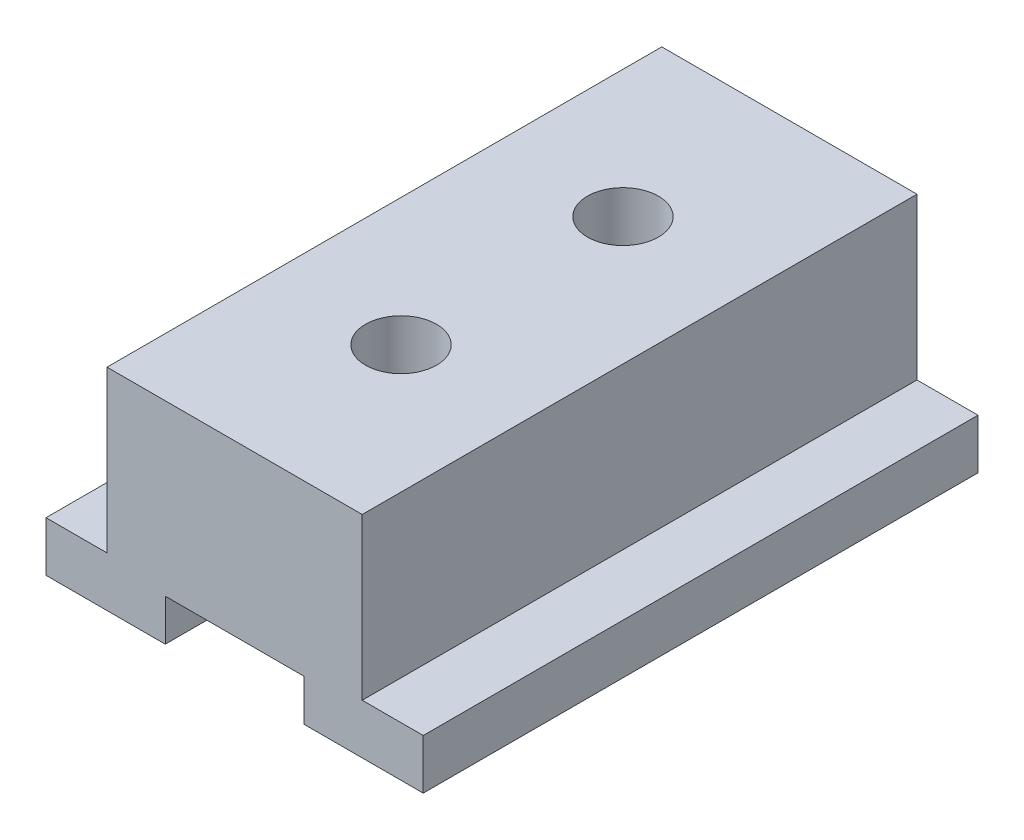
ISO-10303-21;
HEADER;
FILE_DESCRIPTION(('STEP AP214'),'2;1');
FILE_NAME('part.step','',(''),(''),'','','');
FILE_SCHEMA(('AUTOMOTIVE_DESIGN { 1 0 10303 214 1 1 1 1 }'));
ENDSEC;
DATA;
#1=APPLICATION_CONTEXT('core data for automotive mechanical design processes');
#2=APPLICATION_PROTOCOL_DEFINITION('international standard','automotive_design',2000,#1);
#3=PRODUCT_CONTEXT('',#1,'mechanical');
#4=PRODUCT('Part','Part','',(#3));
#5=PRODUCT_RELATED_PRODUCT_CATEGORY('part','',(#4));
#6=PRODUCT_DEFINITION_FORMATION('','',#4);
#7=PRODUCT_DEFINITION_CONTEXT('part definition',#1,'design');
#8=PRODUCT_DEFINITION('design','',#6,#7);
#9=PRODUCT_DEFINITION_SHAPE('','',#8);
#10=(LENGTH_UNIT() NAMED_UNIT(*) SI_UNIT(.MILLI.,.METRE.));
#11=(NAMED_UNIT(*) PLANE_ANGLE_UNIT() SI_UNIT($,.RADIAN.));
#12=(NAMED_UNIT(*) SI_UNIT($,.STERADIAN.) SOLID_ANGLE_UNIT());
#13=UNCERTAINTY_MEASURE_WITH_UNIT(LENGTH_MEASURE(1.E-05),#10,'distance_accuracy_value','');
#14=(GEOMETRIC_REPRESENTATION_CONTEXT(3) GLOBAL_UNCERTAINTY_ASSIGNED_CONTEXT((#13)) GLOBAL_UNIT_ASSIGNED_CONTEXT((#10,
#11,#12)) REPRESENTATION_CONTEXT('',''));
#15=CARTESIAN_POINT('',(0.,0.,0.));
#16=DIRECTION('',(0.,0.,1.));
#17=DIRECTION('',(1.,0.,0.));
#18=AXIS2_PLACEMENT_3D('',#15,#16,#17);
#19=CARTESIAN_POINT('',(10.75,0.,50.));
#20=DIRECTION('',(0.,1.,0.));
#21=DIRECTION('',(-1.,0.,0.));
#22=AXIS2_PLACEMENT_3D('',#19,#20,#21);
#23=PLANE('',#22);
#24=DIRECTION('',(1.,0.,0.));
#25=VECTOR('',#24,1.);
#26=CARTESIAN_POINT('',(10.75,0.,0.));
#27=LINE('',#26,#25);
#28=CARTESIAN_POINT('',(0.,0.,0.));
#29=VERTEX_POINT('',#28);
#30=CARTESIAN_POINT('',(10.75,0.,0.));
#31=VERTEX_POINT('',#30);
#32=EDGE_CURVE('E154',#29,#31,#27,.T.);
#33=ORIENTED_EDGE('',*,*,#32,.T.);
#34=DIRECTION('',(0.,0.,-1.));
#35=VECTOR('',#34,1.);
#36=CARTESIAN_POINT('',(10.75,0.,50.));
#37=LINE('',#36,#35);
#38=CARTESIAN_POINT('',(10.75,0.,50.));
#39=VERTEX_POINT('',#38);
#40=EDGE_CURVE('E11',#39,#31,#37,.T.);
#41=ORIENTED_EDGE('',*,*,#40,.F.);
#42=DIRECTION('',(1.,0.,0.));
#43=VECTOR('',#42,1.);
#44=CARTESIAN_POINT('',(10.75,0.,50.));
#45=LINE('',#44,#43);
#46=CARTESIAN_POINT('',(0.,0.,50.));
#47=VERTEX_POINT('',#46);
#48=EDGE_CURVE('E177',#47,#39,#45,.T.);
#49=ORIENTED_EDGE('',*,*,#48,.F.);
#50=DIRECTION('',(0.,0.,-1.));
#51=VECTOR('',#50,1.);
#52=CARTESIAN_POINT('',(0.,0.,50.));
#53=LINE('',#52,#51);
#54=EDGE_CURVE('E150',#47,#29,#53,.T.);
#55=ORIENTED_EDGE('',*,*,#54,.T.);
#56=EDGE_LOOP('',(#33,#41,#49,#55));
#57=FACE_BOUND('',#56,.T.);
#58=ADVANCED_FACE('F34',(#57),#23,.F.);
#59=CARTESIAN_POINT('',(10.75,3.75,50.));
#60=DIRECTION('',(-1.,0.,0.));
#61=DIRECTION('',(0.,0.,1.));
#62=AXIS2_PLACEMENT_3D('',#59,#60,#61);
#63=PLANE('',#62);
#64=DIRECTION('',(0.,1.,0.));
#65=VECTOR('',#64,1.);
#66=CARTESIAN_POINT('',(10.75,3.75,0.));
#67=LINE('',#66,#65);
#68=CARTESIAN_POINT('',(10.75,3.75,0.));
#69=VERTEX_POINT('',#68);
#70=EDGE_CURVE('E157',#31,#69,#67,.T.);
#71=ORIENTED_EDGE('',*,*,#70,.T.);
#72=DIRECTION('',(0.,0.,-1.));
#73=VECTOR('',#72,1.);
#74=CARTESIAN_POINT('',(10.75,3.75,50.));
#75=LINE('',#74,#73);
#76=CARTESIAN_POINT('',(10.75,3.75,50.));
#77=VERTEX_POINT('',#76);
#78=EDGE_CURVE('E42',#77,#69,#75,.T.);
#79=ORIENTED_EDGE('',*,*,#78,.F.);
#80=DIRECTION('',(0.,1.,0.));
#81=VECTOR('',#80,1.);
#82=CARTESIAN_POINT('',(10.75,3.75,50.));
#83=LINE('',#82,#81);
#84=EDGE_CURVE('E105',#39,#77,#83,.T.);
#85=ORIENTED_EDGE('',*,*,#84,.F.);
#86=ORIENTED_EDGE('',*,*,#40,.T.);
#87=EDGE_LOOP('',(#71,#79,#85,#86));
#88=FACE_BOUND('',#87,.T.);
#89=ADVANCED_FACE('F255',(#88),#63,.F.);
#90=CARTESIAN_POINT('',(10.75,3.75,50.));
#91=DIRECTION('',(0.,1.,0.));
#92=DIRECTION('',(0.,0.,1.));
#93=AXIS2_PLACEMENT_3D('',#90,#91,#92);
#94=PLANE('',#93);
#95=CARTESIAN_POINT('',(17.,3.75,15.));
#96=DIRECTION('',(0.,1.,0.));
#97=DIRECTION('',(0.,0.,1.));
#98=AXIS2_PLACEMENT_3D('',#95,#96,#97);
#99=CIRCLE('',#98,3.19999999999999);
#100=CARTESIAN_POINT('',(17.,3.75,18.2));
#101=VERTEX_POINT('',#100);
#102=EDGE_CURVE('E356',#101,#101,#99,.T.);
#103=ORIENTED_EDGE('',*,*,#102,.T.);
#104=EDGE_LOOP('',(#103));
#105=FACE_BOUND('',#104,.T.);
#106=CARTESIAN_POINT('',(17.,3.75,35.));
#107=DIRECTION('',(0.,1.,0.));
#108=DIRECTION('',(0.,0.,1.));
#109=AXIS2_PLACEMENT_3D('',#106,#107,#108);
#110=CIRCLE('',#109,3.19999999999999);
#111=CARTESIAN_POINT('',(17.,3.75,38.2));
#112=VERTEX_POINT('',#111);
#113=EDGE_CURVE('E158',#112,#112,#110,.T.);
#114=ORIENTED_EDGE('',*,*,#113,.T.);
#115=EDGE_LOOP('',(#114));
#116=FACE_BOUND('',#115,.T.);
#117=DIRECTION('',(1.,0.,0.));
#118=VECTOR('',#117,1.);
#119=CARTESIAN_POINT('',(10.75,3.75,0.));
#120=LINE('',#119,#118);
#121=CARTESIAN_POINT('',(23.25,3.75,0.));
#122=VERTEX_POINT('',#121);
#123=EDGE_CURVE('E160',#69,#122,#120,.T.);
#124=ORIENTED_EDGE('',*,*,#123,.T.);
#125=DIRECTION('',(0.,0.,-1.));
#126=VECTOR('',#125,1.);
#127=CARTESIAN_POINT('',(23.25,3.75,50.));
#128=LINE('',#127,#126);
#129=CARTESIAN_POINT('',(23.25,3.75,50.));
#130=VERTEX_POINT('',#129);
#131=EDGE_CURVE('E196',#130,#122,#128,.T.);
#132=ORIENTED_EDGE('',*,*,#131,.F.);
#133=DIRECTION('',(1.,0.,0.));
#134=VECTOR('',#133,1.);
#135=CARTESIAN_POINT('',(10.75,3.75,50.));
#136=LINE('',#135,#134);
#137=EDGE_CURVE('E204',#77,#130,#136,.T.);
#138=ORIENTED_EDGE('',*,*,#137,.F.);
#139=ORIENTED_EDGE('',*,*,#78,.T.);
#140=EDGE_LOOP('',(#124,#132,#138,#139));
#141=FACE_BOUND('',#140,.T.);
#142=ADVANCED_FACE('F202',(#105,#116,#141),#94,.F.);
#143=CARTESIAN_POINT('',(23.25,3.75,50.));
#144=DIRECTION('',(1.,0.,0.));
#145=DIRECTION('',(0.,0.,-1.));
#146=AXIS2_PLACEMENT_3D('',#143,#144,#145);
#147=PLANE('',#146);
#148=DIRECTION('',(0.,-1.,0.));
#149=VECTOR('',#148,1.);
#150=CARTESIAN_POINT('',(23.25,3.75,0.));
#151=LINE('',#150,#149);
#152=CARTESIAN_POINT('',(23.25,0.,0.));
#153=VERTEX_POINT('',#152);
#154=EDGE_CURVE('E162',#122,#153,#151,.T.);
#155=ORIENTED_EDGE('',*,*,#154,.T.);
#156=DIRECTION('',(0.,0.,-1.));
#157=VECTOR('',#156,1.);
#158=CARTESIAN_POINT('',(23.25,0.,50.));
#159=LINE('',#158,#157);
#160=CARTESIAN_POINT('',(23.25,0.,50.));
#161=VERTEX_POINT('',#160);
#162=EDGE_CURVE('E193',#161,#153,#159,.T.);
#163=ORIENTED_EDGE('',*,*,#162,.F.);
#164=DIRECTION('',(0.,-1.,0.));
#165=VECTOR('',#164,1.);
#166=CARTESIAN_POINT('',(23.25,3.75,50.));
#167=LINE('',#166,#165);
#168=EDGE_CURVE('E222',#130,#161,#167,.T.);
#169=ORIENTED_EDGE('',*,*,#168,.F.);
#170=ORIENTED_EDGE('',*,*,#131,.T.);
#171=EDGE_LOOP('',(#155,#163,#169,#170));
#172=FACE_BOUND('',#171,.T.);
#173=ADVANCED_FACE('F213',(#172),#147,.F.);
#174=CARTESIAN_POINT('',(34.,0.,50.));
#175=DIRECTION('',(0.,1.,0.));
#176=DIRECTION('',(-1.,0.,0.));
#177=AXIS2_PLACEMENT_3D('',#174,#175,#176);
#178=PLANE('',#177);
#179=DIRECTION('',(1.,0.,0.));
#180=VECTOR('',#179,1.);
#181=CARTESIAN_POINT('',(34.,0.,0.));
#182=LINE('',#181,#180);
#183=CARTESIAN_POINT('',(34.,0.,0.));
#184=VERTEX_POINT('',#183);
#185=EDGE_CURVE('E164',#153,#184,#182,.T.);
#186=ORIENTED_EDGE('',*,*,#185,.T.);
#187=DIRECTION('',(0.,0.,-1.));
#188=VECTOR('',#187,1.);
#189=CARTESIAN_POINT('',(34.,0.,50.));
#190=LINE('',#189,#188);
#191=CARTESIAN_POINT('',(34.,0.,50.));
#192=VERTEX_POINT('',#191);
#193=EDGE_CURVE('E190',#192,#184,#190,.T.);
#194=ORIENTED_EDGE('',*,*,#193,.F.);
#195=DIRECTION('',(1.,0.,0.));
#196=VECTOR('',#195,1.);
#197=CARTESIAN_POINT('',(34.,0.,50.));
#198=LINE('',#197,#196);
#199=EDGE_CURVE('E219',#161,#192,#198,.T.);
#200=ORIENTED_EDGE('',*,*,#199,.F.);
#201=ORIENTED_EDGE('',*,*,#162,.T.);
#202=EDGE_LOOP('',(#186,#194,#200,#201));
#203=FACE_BOUND('',#202,.T.);
#204=ADVANCED_FACE('F217',(#203),#178,.F.);
#205=CARTESIAN_POINT('',(34.,4.5,50.));
#206=DIRECTION('',(-1.,0.,0.));
#207=DIRECTION('',(0.,0.,1.));
#208=AXIS2_PLACEMENT_3D('',#205,#206,#207);
#209=PLANE('',#208);
#210=DIRECTION('',(0.,1.,0.));
#211=VECTOR('',#210,1.);
#212=CARTESIAN_POINT('',(34.,4.5,0.));
#213=LINE('',#212,#211);
#214=CARTESIAN_POINT('',(34.,4.5,0.));
#215=VERTEX_POINT('',#214);
#216=EDGE_CURVE('E166',#184,#215,#213,.T.);
#217=ORIENTED_EDGE('',*,*,#216,.T.);
#218=DIRECTION('',(0.,0.,-1.));
#219=VECTOR('',#218,1.);
#220=CARTESIAN_POINT('',(34.,4.5,50.));
#221=LINE('',#220,#219);
#222=CARTESIAN_POINT('',(34.,4.5,50.));
#223=VERTEX_POINT('',#222);
#224=EDGE_CURVE('E187',#223,#215,#221,.T.);
#225=ORIENTED_EDGE('',*,*,#224,.F.);
#226=DIRECTION('',(0.,1.,0.));
#227=VECTOR('',#226,1.);
#228=CARTESIAN_POINT('',(34.,4.5,50.));
#229=LINE('',#228,#227);
#230=EDGE_CURVE('E221',#192,#223,#229,.T.);
#231=ORIENTED_EDGE('',*,*,#230,.F.);
#232=ORIENTED_EDGE('',*,*,#193,.T.);
#233=EDGE_LOOP('',(#217,#225,#231,#232));
#234=FACE_BOUND('',#233,.T.);
#235=ADVANCED_FACE('F269',(#234),#209,.F.);
#236=CARTESIAN_POINT('',(28.5,4.5,50.));
#237=DIRECTION('',(0.,-1.,0.));
#238=DIRECTION('',(1.,0.,0.));
#239=AXIS2_PLACEMENT_3D('',#236,#237,#238);
#240=PLANE('',#239);
#241=DIRECTION('',(-1.,0.,0.));
#242=VECTOR('',#241,1.);
#243=CARTESIAN_POINT('',(28.5,4.5,0.));
#244=LINE('',#243,#242);
#245=CARTESIAN_POINT('',(28.5,4.5,0.));
#246=VERTEX_POINT('',#245);
#247=EDGE_CURVE('E168',#215,#246,#244,.T.);
#248=ORIENTED_EDGE('',*,*,#247,.T.);
#249=DIRECTION('',(0.,0.,-1.));
#250=VECTOR('',#249,1.);
#251=CARTESIAN_POINT('',(28.5,4.5,50.));
#252=LINE('',#251,#250);
#253=CARTESIAN_POINT('',(28.5,4.5,50.));
#254=VERTEX_POINT('',#253);
#255=EDGE_CURVE('E184',#254,#246,#252,.T.);
#256=ORIENTED_EDGE('',*,*,#255,.F.);
#257=DIRECTION('',(-1.,0.,0.));
#258=VECTOR('',#257,1.);
#259=CARTESIAN_POINT('',(28.5,4.5,50.));
#260=LINE('',#259,#258);
#261=EDGE_CURVE('E224',#223,#254,#260,.T.);
#262=ORIENTED_EDGE('',*,*,#261,.F.);
#263=ORIENTED_EDGE('',*,*,#224,.T.);
#264=EDGE_LOOP('',(#248,#256,#262,#263));
#265=FACE_BOUND('',#264,.T.);
#266=ADVANCED_FACE('F272',(#265),#240,.F.);
#267=CARTESIAN_POINT('',(28.5,19.,50.));
#268=DIRECTION('',(-1.,0.,0.));
#269=DIRECTION('',(0.,0.,1.));
#270=AXIS2_PLACEMENT_3D('',#267,#268,#269);
#271=PLANE('',#270);
#272=DIRECTION('',(0.,1.,0.));
#273=VECTOR('',#272,1.);
#274=CARTESIAN_POINT('',(28.5,19.,0.));
#275=LINE('',#274,#273);
#276=CARTESIAN_POINT('',(28.5,19.,0.));
#277=VERTEX_POINT('',#276);
#278=EDGE_CURVE('E170',#246,#277,#275,.T.);
#279=ORIENTED_EDGE('',*,*,#278,.T.);
#280=DIRECTION('',(0.,0.,-1.));
#281=VECTOR('',#280,1.);
#282=CARTESIAN_POINT('',(28.5,19.,50.));
#283=LINE('',#282,#281);
#284=CARTESIAN_POINT('',(28.5,19.,50.));
#285=VERTEX_POINT('',#284);
#286=EDGE_CURVE('E181',#285,#277,#283,.T.);
#287=ORIENTED_EDGE('',*,*,#286,.F.);
#288=DIRECTION('',(0.,1.,0.));
#289=VECTOR('',#288,1.);
#290=CARTESIAN_POINT('',(28.5,19.,50.));
#291=LINE('',#290,#289);
#292=EDGE_CURVE('E230',#254,#285,#291,.T.);
#293=ORIENTED_EDGE('',*,*,#292,.F.);
#294=ORIENTED_EDGE('',*,*,#255,.T.);
#295=EDGE_LOOP('',(#279,#287,#293,#294));
#296=FACE_BOUND('',#295,.T.);
#297=ADVANCED_FACE('F236',(#296),#271,.F.);
#298=CARTESIAN_POINT('',(5.5,19.,50.));
#299=DIRECTION('',(0.,-1.,0.));
#300=DIRECTION('',(0.,0.,-1.));
#301=AXIS2_PLACEMENT_3D('',#298,#299,#300);
#302=PLANE('',#301);
#303=CARTESIAN_POINT('',(17.,19.,15.));
#304=DIRECTION('',(0.,1.,0.));
#305=DIRECTION('',(0.,0.,1.));
#306=AXIS2_PLACEMENT_3D('',#303,#304,#305);
#307=CIRCLE('',#306,3.19999999999999);
#308=CARTESIAN_POINT('',(17.,19.,18.2));
#309=VERTEX_POINT('',#308);
#310=EDGE_CURVE('E353',#309,#309,#307,.T.);
#311=ORIENTED_EDGE('',*,*,#310,.F.);
#312=EDGE_LOOP('',(#311));
#313=FACE_BOUND('',#312,.T.);
#314=CARTESIAN_POINT('',(17.,19.,35.));
#315=DIRECTION('',(0.,1.,0.));
#316=DIRECTION('',(0.,0.,1.));
#317=AXIS2_PLACEMENT_3D('',#314,#315,#316);
#318=CIRCLE('',#317,3.19999999999999);
#319=CARTESIAN_POINT('',(17.,19.,38.2));
#320=VERTEX_POINT('',#319);
#321=EDGE_CURVE('E357',#320,#320,#318,.T.);
#322=ORIENTED_EDGE('',*,*,#321,.F.);
#323=EDGE_LOOP('',(#322));
#324=FACE_BOUND('',#323,.T.);
#325=DIRECTION('',(-1.,0.,0.));
#326=VECTOR('',#325,1.);
#327=CARTESIAN_POINT('',(5.5,19.,0.));
#328=LINE('',#327,#326);
#329=CARTESIAN_POINT('',(5.5,19.,0.));
#330=VERTEX_POINT('',#329);
#331=EDGE_CURVE('E172',#277,#330,#328,.T.);
#332=ORIENTED_EDGE('',*,*,#331,.T.);
#333=DIRECTION('',(0.,0.,-1.));
#334=VECTOR('',#333,1.);
#335=CARTESIAN_POINT('',(5.5,19.,50.));
#336=LINE('',#335,#334);
#337=CARTESIAN_POINT('',(5.5,19.,50.));
#338=VERTEX_POINT('',#337);
#339=EDGE_CURVE('E145',#338,#330,#336,.T.);
#340=ORIENTED_EDGE('',*,*,#339,.F.);
#341=DIRECTION('',(-1.,0.,0.));
#342=VECTOR('',#341,1.);
#343=CARTESIAN_POINT('',(5.5,19.,50.));
#344=LINE('',#343,#342);
#345=EDGE_CURVE('E136',#285,#338,#344,.T.);
#346=ORIENTED_EDGE('',*,*,#345,.F.);
#347=ORIENTED_EDGE('',*,*,#286,.T.);
#348=EDGE_LOOP('',(#332,#340,#346,#347));
#349=FACE_BOUND('',#348,.T.);
#350=ADVANCED_FACE('F240',(#313,#324,#349),#302,.F.);
#351=CARTESIAN_POINT('',(5.5,4.5,50.));
#352=DIRECTION('',(1.,0.,0.));
#353=DIRECTION('',(0.,0.,-1.));
#354=AXIS2_PLACEMENT_3D('',#351,#352,#353);
#355=PLANE('',#354);
#356=DIRECTION('',(0.,-1.,0.));
#357=VECTOR('',#356,1.);
#358=CARTESIAN_POINT('',(5.5,4.5,0.));
#359=LINE('',#358,#357);
#360=CARTESIAN_POINT('',(5.5,4.5,0.));
#361=VERTEX_POINT('',#360);
#362=EDGE_CURVE('E144',#330,#361,#359,.T.);
#363=ORIENTED_EDGE('',*,*,#362,.T.);
#364=DIRECTION('',(0.,0.,-1.));
#365=VECTOR('',#364,1.);
#366=CARTESIAN_POINT('',(5.5,4.5,50.));
#367=LINE('',#366,#365);
#368=CARTESIAN_POINT('',(5.5,4.5,50.));
#369=VERTEX_POINT('',#368);
#370=EDGE_CURVE('E141',#369,#361,#367,.T.);
#371=ORIENTED_EDGE('',*,*,#370,.F.);
#372=DIRECTION('',(0.,-1.,0.));
#373=VECTOR('',#372,1.);
#374=CARTESIAN_POINT('',(5.5,4.5,50.));
#375=LINE('',#374,#373);
#376=EDGE_CURVE('E130',#338,#369,#375,.T.);
#377=ORIENTED_EDGE('',*,*,#376,.F.);
#378=ORIENTED_EDGE('',*,*,#339,.T.);
#379=EDGE_LOOP('',(#363,#371,#377,#378));
#380=FACE_BOUND('',#379,.T.);
#381=ADVANCED_FACE('F142',(#380),#355,.F.);
#382=CARTESIAN_POINT('',(0.,4.5,50.));
#383=DIRECTION('',(0.,-1.,0.));
#384=DIRECTION('',(1.,0.,0.));
#385=AXIS2_PLACEMENT_3D('',#382,#383,#384);
#386=PLANE('',#385);
#387=DIRECTION('',(-1.,0.,0.));
#388=VECTOR('',#387,1.);
#389=CARTESIAN_POINT('',(0.,4.5,0.));
#390=LINE('',#389,#388);
#391=CARTESIAN_POINT('',(0.,4.5,0.));
#392=VERTEX_POINT('',#391);
#393=EDGE_CURVE('E91',#361,#392,#390,.T.);
#394=ORIENTED_EDGE('',*,*,#393,.T.);
#395=DIRECTION('',(0.,0.,-1.));
#396=VECTOR('',#395,1.);
#397=CARTESIAN_POINT('',(0.,4.5,50.));
#398=LINE('',#397,#396);
#399=CARTESIAN_POINT('',(0.,4.5,50.));
#400=VERTEX_POINT('',#399);
#401=EDGE_CURVE('E146',#400,#392,#398,.T.);
#402=ORIENTED_EDGE('',*,*,#401,.F.);
#403=DIRECTION('',(-1.,0.,0.));
#404=VECTOR('',#403,1.);
#405=CARTESIAN_POINT('',(0.,4.5,50.));
#406=LINE('',#405,#404);
#407=EDGE_CURVE('E134',#369,#400,#406,.T.);
#408=ORIENTED_EDGE('',*,*,#407,.F.);
#409=ORIENTED_EDGE('',*,*,#370,.T.);
#410=EDGE_LOOP('',(#394,#402,#408,#409));
#411=FACE_BOUND('',#410,.T.);
#412=ADVANCED_FACE('F148',(#411),#386,.F.);
#413=CARTESIAN_POINT('',(0.,0.,50.));
#414=DIRECTION('',(1.,0.,0.));
#415=DIRECTION('',(0.,0.,-1.));
#416=AXIS2_PLACEMENT_3D('',#413,#414,#415);
#417=PLANE('',#416);
#418=DIRECTION('',(0.,-1.,0.));
#419=VECTOR('',#418,1.);
#420=CARTESIAN_POINT('',(0.,0.,0.));
#421=LINE('',#420,#419);
#422=EDGE_CURVE('E97',#392,#29,#421,.T.);
#423=ORIENTED_EDGE('',*,*,#422,.T.);
#424=ORIENTED_EDGE('',*,*,#54,.F.);
#425=DIRECTION('',(0.,-1.,0.));
#426=VECTOR('',#425,1.);
#427=CARTESIAN_POINT('',(0.,0.,50.));
#428=LINE('',#427,#426);
#429=EDGE_CURVE('E50',#400,#47,#428,.T.);
#430=ORIENTED_EDGE('',*,*,#429,.F.);
#431=ORIENTED_EDGE('',*,*,#401,.T.);
#432=EDGE_LOOP('',(#423,#424,#430,#431));
#433=FACE_BOUND('',#432,.T.);
#434=ADVANCED_FACE('F244',(#433),#417,.F.);
#435=CARTESIAN_POINT('',(0.,0.,50.));
#436=DIRECTION('',(0.,0.,-1.));
#437=DIRECTION('',(-1.,0.,0.));
#438=AXIS2_PLACEMENT_3D('',#435,#436,#437);
#439=PLANE('',#438);
#440=ORIENTED_EDGE('',*,*,#48,.T.);
#441=ORIENTED_EDGE('',*,*,#84,.T.);
#442=ORIENTED_EDGE('',*,*,#137,.T.);
#443=ORIENTED_EDGE('',*,*,#168,.T.);
#444=ORIENTED_EDGE('',*,*,#199,.T.);
#445=ORIENTED_EDGE('',*,*,#230,.T.);
#446=ORIENTED_EDGE('',*,*,#261,.T.);
#447=ORIENTED_EDGE('',*,*,#292,.T.);
#448=ORIENTED_EDGE('',*,*,#345,.T.);
#449=ORIENTED_EDGE('',*,*,#376,.T.);
#450=ORIENTED_EDGE('',*,*,#407,.T.);
#451=ORIENTED_EDGE('',*,*,#429,.T.);
#452=EDGE_LOOP('',(#440,#441,#442,#443,#444,#445,#446,#447,#448,#449,#450,#451));
#453=FACE_BOUND('',#452,.T.);
#454=ADVANCED_FACE('F132',(#453),#439,.F.);
#455=CARTESIAN_POINT('',(0.,0.,0.));
#456=DIRECTION('',(0.,0.,-1.));
#457=DIRECTION('',(-1.,0.,0.));
#458=AXIS2_PLACEMENT_3D('',#455,#456,#457);
#459=PLANE('',#458);
#460=ORIENTED_EDGE('',*,*,#32,.F.);
#461=ORIENTED_EDGE('',*,*,#422,.F.);
#462=ORIENTED_EDGE('',*,*,#393,.F.);
#463=ORIENTED_EDGE('',*,*,#362,.F.);
#464=ORIENTED_EDGE('',*,*,#331,.F.);
#465=ORIENTED_EDGE('',*,*,#278,.F.);
#466=ORIENTED_EDGE('',*,*,#247,.F.);
#467=ORIENTED_EDGE('',*,*,#216,.F.);
#468=ORIENTED_EDGE('',*,*,#185,.F.);
#469=ORIENTED_EDGE('',*,*,#154,.F.);
#470=ORIENTED_EDGE('',*,*,#123,.F.);
#471=ORIENTED_EDGE('',*,*,#70,.F.);
#472=EDGE_LOOP('',(#460,#461,#462,#463,#464,#465,#466,#467,#468,#469,#470,#471));
#473=FACE_BOUND('',#472,.T.);
#474=ADVANCED_FACE('F208',(#473),#459,.T.);
#475=CARTESIAN_POINT('',(17.,19.,35.));
#476=DIRECTION('',(0.,1.,0.));
#477=DIRECTION('',(0.,0.,1.));
#478=AXIS2_PLACEMENT_3D('',#475,#476,#477);
#479=CYLINDRICAL_SURFACE('',#478,3.19999999999999);
#480=ORIENTED_EDGE('',*,*,#321,.T.);
#481=EDGE_LOOP('',(#480));
#482=FACE_BOUND('',#481,.T.);
#483=ORIENTED_EDGE('',*,*,#113,.F.);
#484=EDGE_LOOP('',(#483));
#485=FACE_BOUND('',#484,.T.);
#486=ADVANCED_FACE('F311',(#482,#485),#479,.F.);
#487=CARTESIAN_POINT('',(17.,19.,15.));
#488=DIRECTION('',(0.,1.,0.));
#489=DIRECTION('',(0.,0.,1.));
#490=AXIS2_PLACEMENT_3D('',#487,#488,#489);
#491=CYLINDRICAL_SURFACE('',#490,3.19999999999999);
#492=ORIENTED_EDGE('',*,*,#310,.T.);
#493=EDGE_LOOP('',(#492));
#494=FACE_BOUND('',#493,.T.);
#495=ORIENTED_EDGE('',*,*,#102,.F.);
#496=EDGE_LOOP('',(#495));
#497=FACE_BOUND('',#496,.T.);
#498=ADVANCED_FACE('F333',(#494,#497),#491,.F.);
#499=CLOSED_SHELL('',(#58,#89,#142,#173,#204,#235,#266,#297,#350,#381,#412,#434,#454,#474,#486,#498));
#500=MANIFOLD_SOLID_BREP('B2',#499);
#501=ADVANCED_BREP_SHAPE_REPRESENTATION('',(#18,#500),#14);
#502=SHAPE_DEFINITION_REPRESENTATION(#9,#501);
ENDSEC;
END-ISO-10303-21;
